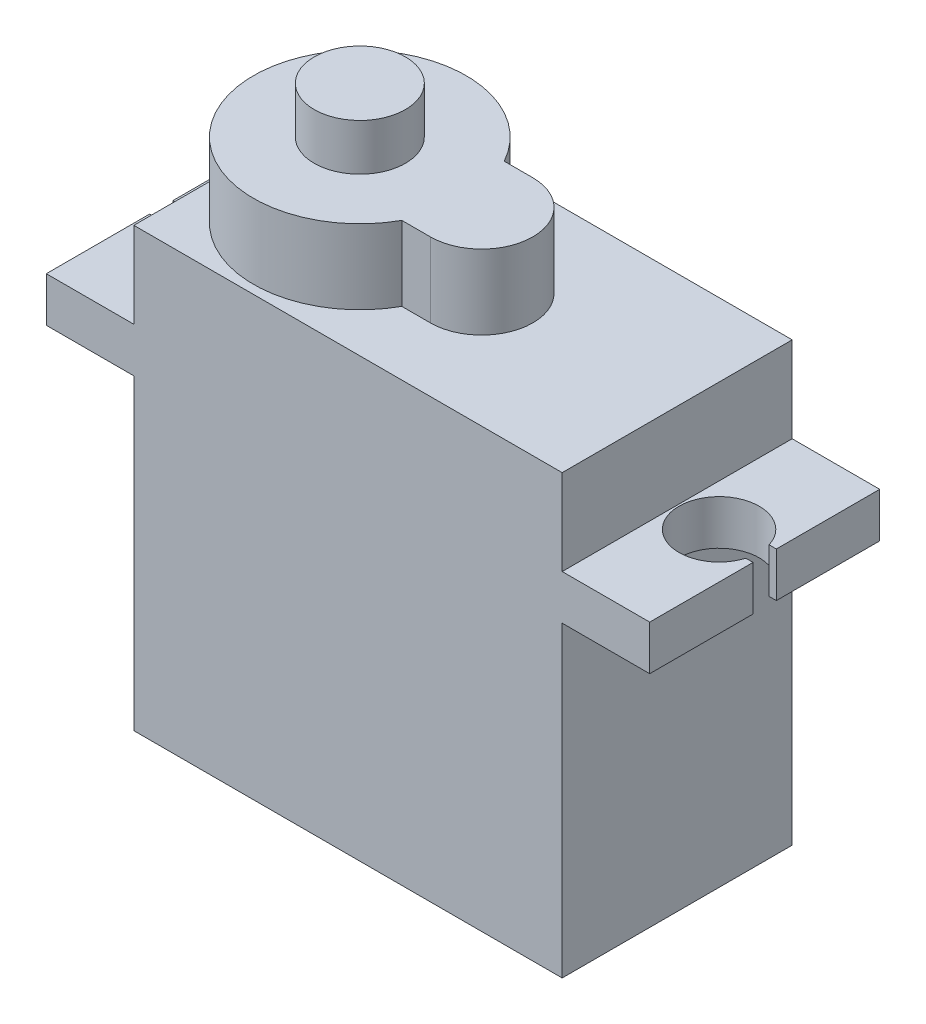
ISO-10303-21;
HEADER;
FILE_DESCRIPTION(('STEP AP214'),'2;1');
FILE_NAME('part.step','',(''),(''),'','','');
FILE_SCHEMA(('AUTOMOTIVE_DESIGN { 1 0 10303 214 1 1 1 1 }'));
ENDSEC;
DATA;
#1=APPLICATION_CONTEXT('core data for automotive mechanical design processes');
#2=APPLICATION_PROTOCOL_DEFINITION('international standard','automotive_design',2000,#1);
#3=PRODUCT_CONTEXT('',#1,'mechanical');
#4=PRODUCT('Part','Part','',(#3));
#5=PRODUCT_RELATED_PRODUCT_CATEGORY('part','',(#4));
#6=PRODUCT_DEFINITION_FORMATION('','',#4);
#7=PRODUCT_DEFINITION_CONTEXT('part definition',#1,'design');
#8=PRODUCT_DEFINITION('design','',#6,#7);
#9=PRODUCT_DEFINITION_SHAPE('','',#8);
#10=(LENGTH_UNIT() NAMED_UNIT(*) SI_UNIT(.MILLI.,.METRE.));
#11=(NAMED_UNIT(*) PLANE_ANGLE_UNIT() SI_UNIT($,.RADIAN.));
#12=(NAMED_UNIT(*) SI_UNIT($,.STERADIAN.) SOLID_ANGLE_UNIT());
#13=UNCERTAINTY_MEASURE_WITH_UNIT(LENGTH_MEASURE(1.E-05),#10,'distance_accuracy_value','');
#14=(GEOMETRIC_REPRESENTATION_CONTEXT(3) GLOBAL_UNCERTAINTY_ASSIGNED_CONTEXT((#13)) GLOBAL_UNIT_ASSIGNED_CONTEXT((#10,
#11,#12)) REPRESENTATION_CONTEXT('',''));
#15=CARTESIAN_POINT('',(0.,0.,0.));
#16=DIRECTION('',(0.,0.,1.));
#17=DIRECTION('',(1.,0.,0.));
#18=AXIS2_PLACEMENT_3D('',#15,#16,#17);
#19=CARTESIAN_POINT('',(-4.7,18.9,6.175));
#20=DIRECTION('',(1.,0.,0.));
#21=DIRECTION('',(0.,0.,-1.));
#22=AXIS2_PLACEMENT_3D('',#19,#20,#21);
#23=PLANE('',#22);
#24=DIRECTION('',(0.,0.,-1.));
#25=VECTOR('',#24,1.);
#26=CARTESIAN_POINT('',(-4.7,18.9,6.175));
#27=LINE('',#26,#25);
#28=CARTESIAN_POINT('',(-4.7,18.9,6.175));
#29=VERTEX_POINT('',#28);
#30=CARTESIAN_POINT('',(-4.7,18.9,0.625));
#31=VERTEX_POINT('',#30);
#32=EDGE_CURVE('E349',#29,#31,#27,.T.);
#33=ORIENTED_EDGE('',*,*,#32,.T.);
#34=DIRECTION('',(0.,1.,0.));
#35=VECTOR('',#34,1.);
#36=CARTESIAN_POINT('',(-4.7,-0.001000000000001,0.625));
#37=LINE('',#36,#35);
#38=CARTESIAN_POINT('',(-4.7,16.5,0.625));
#39=VERTEX_POINT('',#38);
#40=EDGE_CURVE('E224',#39,#31,#37,.T.);
#41=ORIENTED_EDGE('',*,*,#40,.F.);
#42=DIRECTION('',(0.,0.,-1.));
#43=VECTOR('',#42,1.);
#44=CARTESIAN_POINT('',(-4.7,16.5,6.175));
#45=LINE('',#44,#43);
#46=CARTESIAN_POINT('',(-4.7,16.5,6.175));
#47=VERTEX_POINT('',#46);
#48=EDGE_CURVE('E346',#47,#39,#45,.T.);
#49=ORIENTED_EDGE('',*,*,#48,.F.);
#50=DIRECTION('',(0.,-1.,0.));
#51=VECTOR('',#50,1.);
#52=CARTESIAN_POINT('',(-4.7,18.9,6.175));
#53=LINE('',#52,#51);
#54=EDGE_CURVE('E311',#29,#47,#53,.T.);
#55=ORIENTED_EDGE('',*,*,#54,.F.);
#56=EDGE_LOOP('',(#33,#41,#49,#55));
#57=FACE_BOUND('',#56,.T.);
#58=ADVANCED_FACE('F33',(#57),#23,.F.);
#59=CARTESIAN_POINT('',(27.7,16.5,6.175));
#60=DIRECTION('',(-1.,0.,0.));
#61=DIRECTION('',(0.,-1.,0.));
#62=AXIS2_PLACEMENT_3D('',#59,#60,#61);
#63=PLANE('',#62);
#64=DIRECTION('',(0.,0.,-1.));
#65=VECTOR('',#64,1.);
#66=CARTESIAN_POINT('',(27.7,18.9,6.175));
#67=LINE('',#66,#65);
#68=CARTESIAN_POINT('',(27.7,18.9,-0.625));
#69=VERTEX_POINT('',#68);
#70=CARTESIAN_POINT('',(27.7,18.9,-6.175));
#71=VERTEX_POINT('',#70);
#72=EDGE_CURVE('E364',#69,#71,#67,.T.);
#73=ORIENTED_EDGE('',*,*,#72,.F.);
#74=DIRECTION('',(0.,1.,0.));
#75=VECTOR('',#74,1.);
#76=CARTESIAN_POINT('',(27.7,-0.001000000000001,-0.625));
#77=LINE('',#76,#75);
#78=CARTESIAN_POINT('',(27.7,16.5,-0.625));
#79=VERTEX_POINT('',#78);
#80=EDGE_CURVE('E241',#79,#69,#77,.T.);
#81=ORIENTED_EDGE('',*,*,#80,.F.);
#82=DIRECTION('',(0.,0.,-1.));
#83=VECTOR('',#82,1.);
#84=CARTESIAN_POINT('',(27.7,16.5,6.175));
#85=LINE('',#84,#83);
#86=CARTESIAN_POINT('',(27.7,16.5,-6.175));
#87=VERTEX_POINT('',#86);
#88=EDGE_CURVE('E368',#79,#87,#85,.T.);
#89=ORIENTED_EDGE('',*,*,#88,.T.);
#90=DIRECTION('',(0.,1.,0.));
#91=VECTOR('',#90,1.);
#92=CARTESIAN_POINT('',(27.7,16.5,-6.175));
#93=LINE('',#92,#91);
#94=EDGE_CURVE('E325',#87,#71,#93,.T.);
#95=ORIENTED_EDGE('',*,*,#94,.T.);
#96=EDGE_LOOP('',(#73,#81,#89,#95));
#97=FACE_BOUND('',#96,.T.);
#98=ADVANCED_FACE('F438',(#97),#63,.F.);
#99=CARTESIAN_POINT('',(5.96,27.5,0.));
#100=DIRECTION('',(0.,1.,0.));
#101=DIRECTION('',(-1.,0.,0.));
#102=AXIS2_PLACEMENT_3D('',#99,#100,#101);
#103=PLANE('',#102);
#104=CARTESIAN_POINT('',(5.96,27.5,0.));
#105=DIRECTION('',(0.,1.,0.));
#106=DIRECTION('',(-1.,0.,0.));
#107=AXIS2_PLACEMENT_3D('',#104,#105,#106);
#108=CIRCLE('',#107,5.71);
#109=CARTESIAN_POINT('',(10.9641582708783,27.5,-2.75));
#110=VERTEX_POINT('',#109);
#111=CARTESIAN_POINT('',(10.9641582708783,27.5,2.75));
#112=VERTEX_POINT('',#111);
#113=EDGE_CURVE('E256',#110,#112,#108,.T.);
#114=ORIENTED_EDGE('',*,*,#113,.T.);
#115=DIRECTION('',(1.,0.,0.));
#116=VECTOR('',#115,1.);
#117=CARTESIAN_POINT('',(12.5,27.5,2.75));
#118=LINE('',#117,#116);
#119=CARTESIAN_POINT('',(12.5,27.5,2.75));
#120=VERTEX_POINT('',#119);
#121=EDGE_CURVE('E259',#112,#120,#118,.T.);
#122=ORIENTED_EDGE('',*,*,#121,.T.);
#123=CARTESIAN_POINT('',(12.5,27.5,0.));
#124=DIRECTION('',(0.,1.,0.));
#125=DIRECTION('',(-1.,0.,0.));
#126=AXIS2_PLACEMENT_3D('',#123,#124,#125);
#127=CIRCLE('',#126,2.75);
#128=CARTESIAN_POINT('',(12.5,27.5,-2.75));
#129=VERTEX_POINT('',#128);
#130=EDGE_CURVE('E262',#120,#129,#127,.T.);
#131=ORIENTED_EDGE('',*,*,#130,.T.);
#132=DIRECTION('',(-1.,0.,0.));
#133=VECTOR('',#132,1.);
#134=CARTESIAN_POINT('',(12.5,27.5,-2.75));
#135=LINE('',#134,#133);
#136=EDGE_CURVE('E264',#129,#110,#135,.T.);
#137=ORIENTED_EDGE('',*,*,#136,.T.);
#138=EDGE_LOOP('',(#114,#122,#131,#137));
#139=FACE_BOUND('',#138,.T.);
#140=CARTESIAN_POINT('',(5.96,27.5,0.));
#141=DIRECTION('',(0.,1.,0.));
#142=DIRECTION('',(-1.,0.,0.));
#143=AXIS2_PLACEMENT_3D('',#140,#141,#142);
#144=CIRCLE('',#143,2.45);
#145=CARTESIAN_POINT('',(3.51,27.5,0.));
#146=VERTEX_POINT('',#145);
#147=EDGE_CURVE('E249',#146,#146,#144,.T.);
#148=ORIENTED_EDGE('',*,*,#147,.F.);
#149=EDGE_LOOP('',(#148));
#150=FACE_BOUND('',#149,.T.);
#151=ADVANCED_FACE('F469',(#139,#150),#103,.T.);
#152=CARTESIAN_POINT('',(23.,23.5,6.175));
#153=DIRECTION('',(0.,-1.,0.));
#154=DIRECTION('',(1.,0.,0.));
#155=AXIS2_PLACEMENT_3D('',#152,#153,#154);
#156=PLANE('',#155);
#157=DIRECTION('',(-1.,0.,0.));
#158=VECTOR('',#157,1.);
#159=CARTESIAN_POINT('',(23.,23.5,-6.175));
#160=LINE('',#159,#158);
#161=CARTESIAN_POINT('',(23.,23.5,-6.175));
#162=VERTEX_POINT('',#161);
#163=CARTESIAN_POINT('',(0.,23.5,-6.175));
#164=VERTEX_POINT('',#163);
#165=EDGE_CURVE('E332',#162,#164,#160,.T.);
#166=ORIENTED_EDGE('',*,*,#165,.T.);
#167=DIRECTION('',(0.,0.,-1.));
#168=VECTOR('',#167,1.);
#169=CARTESIAN_POINT('',(0.,23.5,6.175));
#170=LINE('',#169,#168);
#171=CARTESIAN_POINT('',(0.,23.5,6.175));
#172=VERTEX_POINT('',#171);
#173=EDGE_CURVE('E355',#172,#164,#170,.T.);
#174=ORIENTED_EDGE('',*,*,#173,.F.);
#175=DIRECTION('',(-1.,0.,0.));
#176=VECTOR('',#175,1.);
#177=CARTESIAN_POINT('',(23.,23.5,6.175));
#178=LINE('',#177,#176);
#179=CARTESIAN_POINT('',(23.,23.5,6.175));
#180=VERTEX_POINT('',#179);
#181=EDGE_CURVE('E305',#180,#172,#178,.T.);
#182=ORIENTED_EDGE('',*,*,#181,.F.);
#183=DIRECTION('',(0.,0.,-1.));
#184=VECTOR('',#183,1.);
#185=CARTESIAN_POINT('',(23.,23.5,6.175));
#186=LINE('',#185,#184);
#187=EDGE_CURVE('E358',#180,#162,#186,.T.);
#188=ORIENTED_EDGE('',*,*,#187,.T.);
#189=EDGE_LOOP('',(#166,#174,#182,#188));
#190=FACE_BOUND('',#189,.T.);
#191=CARTESIAN_POINT('',(5.96,23.5,0.));
#192=DIRECTION('',(0.,1.,0.));
#193=DIRECTION('',(-1.,0.,0.));
#194=AXIS2_PLACEMENT_3D('',#191,#192,#193);
#195=CIRCLE('',#194,5.71);
#196=CARTESIAN_POINT('',(10.9641582708783,23.5,-2.75));
#197=VERTEX_POINT('',#196);
#198=CARTESIAN_POINT('',(10.9641582708783,23.5,2.75));
#199=VERTEX_POINT('',#198);
#200=EDGE_CURVE('E253',#197,#199,#195,.T.);
#201=ORIENTED_EDGE('',*,*,#200,.F.);
#202=DIRECTION('',(-1.,0.,0.));
#203=VECTOR('',#202,1.);
#204=CARTESIAN_POINT('',(12.5,23.5,-2.75));
#205=LINE('',#204,#203);
#206=CARTESIAN_POINT('',(12.5,23.5,-2.75));
#207=VERTEX_POINT('',#206);
#208=EDGE_CURVE('E260',#207,#197,#205,.T.);
#209=ORIENTED_EDGE('',*,*,#208,.F.);
#210=CARTESIAN_POINT('',(12.5,23.5,0.));
#211=DIRECTION('',(0.,1.,0.));
#212=DIRECTION('',(-1.,0.,0.));
#213=AXIS2_PLACEMENT_3D('',#210,#211,#212);
#214=CIRCLE('',#213,2.75);
#215=CARTESIAN_POINT('',(12.5,23.5,2.75));
#216=VERTEX_POINT('',#215);
#217=EDGE_CURVE('E272',#216,#207,#214,.T.);
#218=ORIENTED_EDGE('',*,*,#217,.F.);
#219=DIRECTION('',(1.,0.,0.));
#220=VECTOR('',#219,1.);
#221=CARTESIAN_POINT('',(12.5,23.5,2.75));
#222=LINE('',#221,#220);
#223=EDGE_CURVE('E269',#199,#216,#222,.T.);
#224=ORIENTED_EDGE('',*,*,#223,.F.);
#225=EDGE_LOOP('',(#201,#209,#218,#224));
#226=FACE_BOUND('',#225,.T.);
#227=ADVANCED_FACE('F424',(#190,#226),#156,.F.);
#228=CARTESIAN_POINT('',(0.,16.5,6.175));
#229=DIRECTION('',(1.,0.,0.));
#230=DIRECTION('',(0.,1.,0.));
#231=AXIS2_PLACEMENT_3D('',#228,#229,#230);
#232=PLANE('',#231);
#233=DIRECTION('',(0.,-1.,0.));
#234=VECTOR('',#233,1.);
#235=CARTESIAN_POINT('',(0.,16.5,-6.175));
#236=LINE('',#235,#234);
#237=CARTESIAN_POINT('',(0.,16.5,-6.175));
#238=VERTEX_POINT('',#237);
#239=CARTESIAN_POINT('',(0.,0.,-6.175));
#240=VERTEX_POINT('',#239);
#241=EDGE_CURVE('E288',#238,#240,#236,.T.);
#242=ORIENTED_EDGE('',*,*,#241,.T.);
#243=DIRECTION('',(0.,0.,-1.));
#244=VECTOR('',#243,1.);
#245=CARTESIAN_POINT('',(0.,0.,6.175));
#246=LINE('',#245,#244);
#247=CARTESIAN_POINT('',(0.,0.,6.175));
#248=VERTEX_POINT('',#247);
#249=EDGE_CURVE('E11',#248,#240,#246,.T.);
#250=ORIENTED_EDGE('',*,*,#249,.F.);
#251=DIRECTION('',(0.,-1.,0.));
#252=VECTOR('',#251,1.);
#253=CARTESIAN_POINT('',(0.,16.5,6.175));
#254=LINE('',#253,#252);
#255=CARTESIAN_POINT('',(0.,16.5,6.175));
#256=VERTEX_POINT('',#255);
#257=EDGE_CURVE('E289',#256,#248,#254,.T.);
#258=ORIENTED_EDGE('',*,*,#257,.F.);
#259=DIRECTION('',(0.,0.,-1.));
#260=VECTOR('',#259,1.);
#261=CARTESIAN_POINT('',(0.,16.5,6.175));
#262=LINE('',#261,#260);
#263=EDGE_CURVE('E315',#256,#238,#262,.T.);
#264=ORIENTED_EDGE('',*,*,#263,.T.);
#265=EDGE_LOOP('',(#242,#250,#258,#264));
#266=FACE_BOUND('',#265,.T.);
#267=ADVANCED_FACE('F35',(#266),#232,.F.);
#268=CARTESIAN_POINT('',(0.,0.,6.175));
#269=DIRECTION('',(0.,1.,0.));
#270=DIRECTION('',(0.,0.,1.));
#271=AXIS2_PLACEMENT_3D('',#268,#269,#270);
#272=PLANE('',#271);
#273=DIRECTION('',(1.,0.,0.));
#274=VECTOR('',#273,1.);
#275=CARTESIAN_POINT('',(0.,0.,-6.175));
#276=LINE('',#275,#274);
#277=CARTESIAN_POINT('',(23.,0.,-6.175));
#278=VERTEX_POINT('',#277);
#279=EDGE_CURVE('E318',#240,#278,#276,.T.);
#280=ORIENTED_EDGE('',*,*,#279,.T.);
#281=DIRECTION('',(0.,0.,-1.));
#282=VECTOR('',#281,1.);
#283=CARTESIAN_POINT('',(23.,0.,6.175));
#284=LINE('',#283,#282);
#285=CARTESIAN_POINT('',(23.,0.,6.175));
#286=VERTEX_POINT('',#285);
#287=EDGE_CURVE('E41',#286,#278,#284,.T.);
#288=ORIENTED_EDGE('',*,*,#287,.F.);
#289=DIRECTION('',(1.,0.,0.));
#290=VECTOR('',#289,1.);
#291=CARTESIAN_POINT('',(0.,0.,6.175));
#292=LINE('',#291,#290);
#293=EDGE_CURVE('E292',#248,#286,#292,.T.);
#294=ORIENTED_EDGE('',*,*,#293,.F.);
#295=ORIENTED_EDGE('',*,*,#249,.T.);
#296=EDGE_LOOP('',(#280,#288,#294,#295));
#297=FACE_BOUND('',#296,.T.);
#298=ADVANCED_FACE('F401',(#297),#272,.F.);
#299=CARTESIAN_POINT('',(23.,0.,6.175));
#300=DIRECTION('',(-1.,0.,0.));
#301=DIRECTION('',(0.,0.,1.));
#302=AXIS2_PLACEMENT_3D('',#299,#300,#301);
#303=PLANE('',#302);
#304=DIRECTION('',(0.,1.,0.));
#305=VECTOR('',#304,1.);
#306=CARTESIAN_POINT('',(23.,0.,-6.175));
#307=LINE('',#306,#305);
#308=CARTESIAN_POINT('',(23.,16.5,-6.175));
#309=VERTEX_POINT('',#308);
#310=EDGE_CURVE('E320',#278,#309,#307,.T.);
#311=ORIENTED_EDGE('',*,*,#310,.T.);
#312=DIRECTION('',(0.,0.,-1.));
#313=VECTOR('',#312,1.);
#314=CARTESIAN_POINT('',(23.,16.5,6.175));
#315=LINE('',#314,#313);
#316=CARTESIAN_POINT('',(23.,16.5,6.175));
#317=VERTEX_POINT('',#316);
#318=EDGE_CURVE('E372',#317,#309,#315,.T.);
#319=ORIENTED_EDGE('',*,*,#318,.F.);
#320=DIRECTION('',(0.,1.,0.));
#321=VECTOR('',#320,1.);
#322=CARTESIAN_POINT('',(23.,0.,6.175));
#323=LINE('',#322,#321);
#324=EDGE_CURVE('E295',#286,#317,#323,.T.);
#325=ORIENTED_EDGE('',*,*,#324,.F.);
#326=ORIENTED_EDGE('',*,*,#287,.T.);
#327=EDGE_LOOP('',(#311,#319,#325,#326));
#328=FACE_BOUND('',#327,.T.);
#329=ADVANCED_FACE('F379',(#328),#303,.F.);
#330=CARTESIAN_POINT('',(23.,16.5,6.175));
#331=DIRECTION('',(0.,1.,0.));
#332=DIRECTION('',(-1.,0.,0.));
#333=AXIS2_PLACEMENT_3D('',#330,#331,#332);
#334=PLANE('',#333);
#335=ORIENTED_EDGE('',*,*,#88,.F.);
#336=DIRECTION('',(1.,0.,0.));
#337=VECTOR('',#336,1.);
#338=CARTESIAN_POINT('',(27.311332336136,16.5,-0.625));
#339=LINE('',#338,#337);
#340=CARTESIAN_POINT('',(27.311332336136,16.5,-0.625));
#341=VERTEX_POINT('',#340);
#342=EDGE_CURVE('E229',#341,#79,#339,.T.);
#343=ORIENTED_EDGE('',*,*,#342,.F.);
#344=CARTESIAN_POINT('',(25.25,16.5,0.));
#345=DIRECTION('',(0.,1.,0.));
#346=DIRECTION('',(-1.,0.,0.));
#347=AXIS2_PLACEMENT_3D('',#344,#345,#346);
#348=CIRCLE('',#347,2.154);
#349=CARTESIAN_POINT('',(27.311332336136,16.5,0.625));
#350=VERTEX_POINT('',#349);
#351=EDGE_CURVE('E209',#350,#341,#348,.F.);
#352=ORIENTED_EDGE('',*,*,#351,.F.);
#353=DIRECTION('',(-1.,0.,0.));
#354=VECTOR('',#353,1.);
#355=CARTESIAN_POINT('',(27.7,16.5,0.625));
#356=LINE('',#355,#354);
#357=CARTESIAN_POINT('',(27.7,16.5,0.625));
#358=VERTEX_POINT('',#357);
#359=EDGE_CURVE('E240',#358,#350,#356,.T.);
#360=ORIENTED_EDGE('',*,*,#359,.F.);
#361=CARTESIAN_POINT('',(27.7,16.5,6.175));
#362=VERTEX_POINT('',#361);
#363=EDGE_CURVE('E369',#362,#358,#85,.T.);
#364=ORIENTED_EDGE('',*,*,#363,.F.);
#365=DIRECTION('',(1.,0.,0.));
#366=VECTOR('',#365,1.);
#367=CARTESIAN_POINT('',(23.,16.5,6.175));
#368=LINE('',#367,#366);
#369=EDGE_CURVE('E297',#317,#362,#368,.T.);
#370=ORIENTED_EDGE('',*,*,#369,.F.);
#371=ORIENTED_EDGE('',*,*,#318,.T.);
#372=DIRECTION('',(1.,0.,0.));
#373=VECTOR('',#372,1.);
#374=CARTESIAN_POINT('',(23.,16.5,-6.175));
#375=LINE('',#374,#373);
#376=EDGE_CURVE('E322',#309,#87,#375,.T.);
#377=ORIENTED_EDGE('',*,*,#376,.T.);
#378=EDGE_LOOP('',(#335,#343,#352,#360,#364,#370,#371,#377));
#379=FACE_BOUND('',#378,.T.);
#380=ADVANCED_FACE('F390',(#379),#334,.F.);
#381=ORIENTED_EDGE('',*,*,#363,.T.);
#382=DIRECTION('',(0.,1.,0.));
#383=VECTOR('',#382,1.);
#384=CARTESIAN_POINT('',(27.7,-0.001000000000001,0.625));
#385=LINE('',#384,#383);
#386=CARTESIAN_POINT('',(27.7,18.9,0.625));
#387=VERTEX_POINT('',#386);
#388=EDGE_CURVE('E243',#358,#387,#385,.T.);
#389=ORIENTED_EDGE('',*,*,#388,.T.);
#390=CARTESIAN_POINT('',(27.7,18.9,6.175));
#391=VERTEX_POINT('',#390);
#392=EDGE_CURVE('E365',#391,#387,#67,.T.);
#393=ORIENTED_EDGE('',*,*,#392,.F.);
#394=DIRECTION('',(0.,1.,0.));
#395=VECTOR('',#394,1.);
#396=CARTESIAN_POINT('',(27.7,16.5,6.175));
#397=LINE('',#396,#395);
#398=EDGE_CURVE('E299',#362,#391,#397,.T.);
#399=ORIENTED_EDGE('',*,*,#398,.F.);
#400=EDGE_LOOP('',(#381,#389,#393,#399));
#401=FACE_BOUND('',#400,.T.);
#402=ADVANCED_FACE('F447',(#401),#63,.F.);
#403=CARTESIAN_POINT('',(27.7,18.9,6.175));
#404=DIRECTION('',(0.,-1.,0.));
#405=DIRECTION('',(1.,0.,0.));
#406=AXIS2_PLACEMENT_3D('',#403,#404,#405);
#407=PLANE('',#406);
#408=CARTESIAN_POINT('',(25.25,18.9,0.));
#409=DIRECTION('',(0.,1.,0.));
#410=DIRECTION('',(0.,0.,-1.));
#411=AXIS2_PLACEMENT_3D('',#408,#409,#410);
#412=CIRCLE('',#411,2.154);
#413=CARTESIAN_POINT('',(27.311332336136,18.9,-0.625));
#414=VERTEX_POINT('',#413);
#415=CARTESIAN_POINT('',(27.311332336136,18.9,0.625));
#416=VERTEX_POINT('',#415);
#417=EDGE_CURVE('E56',#414,#416,#412,.T.);
#418=ORIENTED_EDGE('',*,*,#417,.F.);
#419=DIRECTION('',(-1.,0.,0.));
#420=VECTOR('',#419,1.);
#421=CARTESIAN_POINT('',(27.311332336136,18.9,-0.625));
#422=LINE('',#421,#420);
#423=EDGE_CURVE('E234',#69,#414,#422,.T.);
#424=ORIENTED_EDGE('',*,*,#423,.F.);
#425=ORIENTED_EDGE('',*,*,#72,.T.);
#426=DIRECTION('',(-1.,0.,0.));
#427=VECTOR('',#426,1.);
#428=CARTESIAN_POINT('',(27.7,18.9,-6.175));
#429=LINE('',#428,#427);
#430=CARTESIAN_POINT('',(23.,18.9,-6.175));
#431=VERTEX_POINT('',#430);
#432=EDGE_CURVE('E328',#71,#431,#429,.T.);
#433=ORIENTED_EDGE('',*,*,#432,.T.);
#434=DIRECTION('',(0.,0.,-1.));
#435=VECTOR('',#434,1.);
#436=CARTESIAN_POINT('',(23.,18.9,6.175));
#437=LINE('',#436,#435);
#438=CARTESIAN_POINT('',(23.,18.9,6.175));
#439=VERTEX_POINT('',#438);
#440=EDGE_CURVE('E361',#439,#431,#437,.T.);
#441=ORIENTED_EDGE('',*,*,#440,.F.);
#442=DIRECTION('',(-1.,0.,0.));
#443=VECTOR('',#442,1.);
#444=CARTESIAN_POINT('',(27.7,18.9,6.175));
#445=LINE('',#444,#443);
#446=EDGE_CURVE('E301',#391,#439,#445,.T.);
#447=ORIENTED_EDGE('',*,*,#446,.F.);
#448=ORIENTED_EDGE('',*,*,#392,.T.);
#449=DIRECTION('',(1.,0.,0.));
#450=VECTOR('',#449,1.);
#451=CARTESIAN_POINT('',(27.7,18.9,0.625));
#452=LINE('',#451,#450);
#453=EDGE_CURVE('E232',#416,#387,#452,.T.);
#454=ORIENTED_EDGE('',*,*,#453,.F.);
#455=EDGE_LOOP('',(#418,#424,#425,#433,#441,#447,#448,#454));
#456=FACE_BOUND('',#455,.T.);
#457=ADVANCED_FACE('F432',(#456),#407,.F.);
#458=CARTESIAN_POINT('',(23.,18.9,6.175));
#459=DIRECTION('',(-1.,0.,0.));
#460=DIRECTION('',(0.,0.,1.));
#461=AXIS2_PLACEMENT_3D('',#458,#459,#460);
#462=PLANE('',#461);
#463=DIRECTION('',(0.,1.,0.));
#464=VECTOR('',#463,1.);
#465=CARTESIAN_POINT('',(23.,18.9,-6.175));
#466=LINE('',#465,#464);
#467=EDGE_CURVE('E330',#431,#162,#466,.T.);
#468=ORIENTED_EDGE('',*,*,#467,.T.);
#469=ORIENTED_EDGE('',*,*,#187,.F.);
#470=DIRECTION('',(0.,1.,0.));
#471=VECTOR('',#470,1.);
#472=CARTESIAN_POINT('',(23.,18.9,6.175));
#473=LINE('',#472,#471);
#474=EDGE_CURVE('E303',#439,#180,#473,.T.);
#475=ORIENTED_EDGE('',*,*,#474,.F.);
#476=ORIENTED_EDGE('',*,*,#440,.T.);
#477=EDGE_LOOP('',(#468,#469,#475,#476));
#478=FACE_BOUND('',#477,.T.);
#479=ADVANCED_FACE('F429',(#478),#462,.F.);
#480=CARTESIAN_POINT('',(0.,23.5,6.175));
#481=DIRECTION('',(1.,0.,0.));
#482=DIRECTION('',(0.,1.,0.));
#483=AXIS2_PLACEMENT_3D('',#480,#481,#482);
#484=PLANE('',#483);
#485=DIRECTION('',(0.,-1.,0.));
#486=VECTOR('',#485,1.);
#487=CARTESIAN_POINT('',(0.,23.5,-6.175));
#488=LINE('',#487,#486);
#489=CARTESIAN_POINT('',(0.,18.9,-6.175));
#490=VERTEX_POINT('',#489);
#491=EDGE_CURVE('E334',#164,#490,#488,.T.);
#492=ORIENTED_EDGE('',*,*,#491,.T.);
#493=DIRECTION('',(0.,0.,-1.));
#494=VECTOR('',#493,1.);
#495=CARTESIAN_POINT('',(0.,18.9,6.175));
#496=LINE('',#495,#494);
#497=CARTESIAN_POINT('',(0.,18.9,6.175));
#498=VERTEX_POINT('',#497);
#499=EDGE_CURVE('E352',#498,#490,#496,.T.);
#500=ORIENTED_EDGE('',*,*,#499,.F.);
#501=DIRECTION('',(0.,-1.,0.));
#502=VECTOR('',#501,1.);
#503=CARTESIAN_POINT('',(0.,23.5,6.175));
#504=LINE('',#503,#502);
#505=EDGE_CURVE('E307',#172,#498,#504,.T.);
#506=ORIENTED_EDGE('',*,*,#505,.F.);
#507=ORIENTED_EDGE('',*,*,#173,.T.);
#508=EDGE_LOOP('',(#492,#500,#506,#507));
#509=FACE_BOUND('',#508,.T.);
#510=ADVANCED_FACE('F419',(#509),#484,.F.);
#511=CARTESIAN_POINT('',(0.,18.9,6.175));
#512=DIRECTION('',(0.,-1.,0.));
#513=DIRECTION('',(0.,0.,-1.));
#514=AXIS2_PLACEMENT_3D('',#511,#512,#513);
#515=PLANE('',#514);
#516=CARTESIAN_POINT('',(-2.25,18.9,0.));
#517=DIRECTION('',(0.,1.,0.));
#518=DIRECTION('',(0.,0.,-1.));
#519=AXIS2_PLACEMENT_3D('',#516,#517,#518);
#520=CIRCLE('',#519,2.154);
#521=CARTESIAN_POINT('',(-4.31133233613603,18.9,0.625));
#522=VERTEX_POINT('',#521);
#523=CARTESIAN_POINT('',(-4.31133233613603,18.9,-0.625));
#524=VERTEX_POINT('',#523);
#525=EDGE_CURVE('E201',#522,#524,#520,.T.);
#526=ORIENTED_EDGE('',*,*,#525,.F.);
#527=DIRECTION('',(1.,0.,0.));
#528=VECTOR('',#527,1.);
#529=CARTESIAN_POINT('',(-4.7,18.9,0.625));
#530=LINE('',#529,#528);
#531=EDGE_CURVE('E203',#31,#522,#530,.T.);
#532=ORIENTED_EDGE('',*,*,#531,.F.);
#533=ORIENTED_EDGE('',*,*,#32,.F.);
#534=DIRECTION('',(-1.,0.,0.));
#535=VECTOR('',#534,1.);
#536=CARTESIAN_POINT('',(0.,18.9,6.175));
#537=LINE('',#536,#535);
#538=EDGE_CURVE('E309',#498,#29,#537,.T.);
#539=ORIENTED_EDGE('',*,*,#538,.F.);
#540=ORIENTED_EDGE('',*,*,#499,.T.);
#541=DIRECTION('',(-1.,0.,0.));
#542=VECTOR('',#541,1.);
#543=CARTESIAN_POINT('',(0.,18.9,-6.175));
#544=LINE('',#543,#542);
#545=CARTESIAN_POINT('',(-4.7,18.9,-6.175));
#546=VERTEX_POINT('',#545);
#547=EDGE_CURVE('E336',#490,#546,#544,.T.);
#548=ORIENTED_EDGE('',*,*,#547,.T.);
#549=CARTESIAN_POINT('',(-4.7,18.9,-0.625));
#550=VERTEX_POINT('',#549);
#551=EDGE_CURVE('E348',#550,#546,#27,.T.);
#552=ORIENTED_EDGE('',*,*,#551,.F.);
#553=DIRECTION('',(-1.,0.,0.));
#554=VECTOR('',#553,1.);
#555=CARTESIAN_POINT('',(-4.7,18.9,-0.625));
#556=LINE('',#555,#554);
#557=EDGE_CURVE('E219',#524,#550,#556,.T.);
#558=ORIENTED_EDGE('',*,*,#557,.F.);
#559=EDGE_LOOP('',(#526,#532,#533,#539,#540,#548,#552,#558));
#560=FACE_BOUND('',#559,.T.);
#561=ADVANCED_FACE('F412',(#560),#515,.F.);
#562=CARTESIAN_POINT('',(-4.7,16.5,-0.625000000000001));
#563=VERTEX_POINT('',#562);
#564=CARTESIAN_POINT('',(-4.7,16.5,-6.175));
#565=VERTEX_POINT('',#564);
#566=EDGE_CURVE('E345',#563,#565,#45,.T.);
#567=ORIENTED_EDGE('',*,*,#566,.F.);
#568=DIRECTION('',(0.,1.,0.));
#569=VECTOR('',#568,1.);
#570=CARTESIAN_POINT('',(-4.7,-0.001000000000001,-0.625));
#571=LINE('',#570,#569);
#572=EDGE_CURVE('E48',#563,#550,#571,.T.);
#573=ORIENTED_EDGE('',*,*,#572,.T.);
#574=ORIENTED_EDGE('',*,*,#551,.T.);
#575=DIRECTION('',(0.,-1.,0.));
#576=VECTOR('',#575,1.);
#577=CARTESIAN_POINT('',(-4.7,18.9,-6.175));
#578=LINE('',#577,#576);
#579=EDGE_CURVE('E339',#546,#565,#578,.T.);
#580=ORIENTED_EDGE('',*,*,#579,.T.);
#581=EDGE_LOOP('',(#567,#573,#574,#580));
#582=FACE_BOUND('',#581,.T.);
#583=ADVANCED_FACE('F409',(#582),#23,.F.);
#584=CARTESIAN_POINT('',(-4.7,16.5,6.175));
#585=DIRECTION('',(0.,1.,0.));
#586=DIRECTION('',(0.,0.,1.));
#587=AXIS2_PLACEMENT_3D('',#584,#585,#586);
#588=PLANE('',#587);
#589=ORIENTED_EDGE('',*,*,#48,.T.);
#590=DIRECTION('',(-1.,0.,0.));
#591=VECTOR('',#590,1.);
#592=CARTESIAN_POINT('',(-4.7,16.5,0.625));
#593=LINE('',#592,#591);
#594=CARTESIAN_POINT('',(-4.31133233613603,16.5,0.625));
#595=VERTEX_POINT('',#594);
#596=EDGE_CURVE('E214',#595,#39,#593,.T.);
#597=ORIENTED_EDGE('',*,*,#596,.F.);
#598=CARTESIAN_POINT('',(-2.25,16.5,0.));
#599=DIRECTION('',(0.,1.,0.));
#600=DIRECTION('',(0.,0.,1.));
#601=AXIS2_PLACEMENT_3D('',#598,#599,#600);
#602=CIRCLE('',#601,2.154);
#603=CARTESIAN_POINT('',(-4.31133233613603,16.5,-0.625));
#604=VERTEX_POINT('',#603);
#605=EDGE_CURVE('E198',#604,#595,#602,.F.);
#606=ORIENTED_EDGE('',*,*,#605,.F.);
#607=DIRECTION('',(1.,0.,0.));
#608=VECTOR('',#607,1.);
#609=CARTESIAN_POINT('',(-4.7,16.5,-0.625));
#610=LINE('',#609,#608);
#611=EDGE_CURVE('E205',#563,#604,#610,.T.);
#612=ORIENTED_EDGE('',*,*,#611,.F.);
#613=ORIENTED_EDGE('',*,*,#566,.T.);
#614=DIRECTION('',(1.,0.,0.));
#615=VECTOR('',#614,1.);
#616=CARTESIAN_POINT('',(-4.7,16.5,-6.175));
#617=LINE('',#616,#615);
#618=EDGE_CURVE('E293',#565,#238,#617,.T.);
#619=ORIENTED_EDGE('',*,*,#618,.T.);
#620=ORIENTED_EDGE('',*,*,#263,.F.);
#621=DIRECTION('',(1.,0.,0.));
#622=VECTOR('',#621,1.);
#623=CARTESIAN_POINT('',(-4.7,16.5,6.175));
#624=LINE('',#623,#622);
#625=EDGE_CURVE('E313',#47,#256,#624,.T.);
#626=ORIENTED_EDGE('',*,*,#625,.F.);
#627=EDGE_LOOP('',(#589,#597,#606,#612,#613,#619,#620,#626));
#628=FACE_BOUND('',#627,.T.);
#629=ADVANCED_FACE('F213',(#628),#588,.F.);
#630=CARTESIAN_POINT('',(0.,0.,6.175));
#631=DIRECTION('',(0.,0.,1.));
#632=DIRECTION('',(1.,0.,0.));
#633=AXIS2_PLACEMENT_3D('',#630,#631,#632);
#634=PLANE('',#633);
#635=ORIENTED_EDGE('',*,*,#257,.T.);
#636=ORIENTED_EDGE('',*,*,#293,.T.);
#637=ORIENTED_EDGE('',*,*,#324,.T.);
#638=ORIENTED_EDGE('',*,*,#369,.T.);
#639=ORIENTED_EDGE('',*,*,#398,.T.);
#640=ORIENTED_EDGE('',*,*,#446,.T.);
#641=ORIENTED_EDGE('',*,*,#474,.T.);
#642=ORIENTED_EDGE('',*,*,#181,.T.);
#643=ORIENTED_EDGE('',*,*,#505,.T.);
#644=ORIENTED_EDGE('',*,*,#538,.T.);
#645=ORIENTED_EDGE('',*,*,#54,.T.);
#646=ORIENTED_EDGE('',*,*,#625,.T.);
#647=EDGE_LOOP('',(#635,#636,#637,#638,#639,#640,#641,#642,#643,#644,#645,#646));
#648=FACE_BOUND('',#647,.T.);
#649=ADVANCED_FACE('F397',(#648),#634,.T.);
#650=CARTESIAN_POINT('',(0.,0.,-6.175));
#651=DIRECTION('',(0.,0.,1.));
#652=DIRECTION('',(1.,0.,0.));
#653=AXIS2_PLACEMENT_3D('',#650,#651,#652);
#654=PLANE('',#653);
#655=ORIENTED_EDGE('',*,*,#241,.F.);
#656=ORIENTED_EDGE('',*,*,#618,.F.);
#657=ORIENTED_EDGE('',*,*,#579,.F.);
#658=ORIENTED_EDGE('',*,*,#547,.F.);
#659=ORIENTED_EDGE('',*,*,#491,.F.);
#660=ORIENTED_EDGE('',*,*,#165,.F.);
#661=ORIENTED_EDGE('',*,*,#467,.F.);
#662=ORIENTED_EDGE('',*,*,#432,.F.);
#663=ORIENTED_EDGE('',*,*,#94,.F.);
#664=ORIENTED_EDGE('',*,*,#376,.F.);
#665=ORIENTED_EDGE('',*,*,#310,.F.);
#666=ORIENTED_EDGE('',*,*,#279,.F.);
#667=EDGE_LOOP('',(#655,#656,#657,#658,#659,#660,#661,#662,#663,#664,#665,#666));
#668=FACE_BOUND('',#667,.T.);
#669=ADVANCED_FACE('F385',(#668),#654,.F.);
#670=CARTESIAN_POINT('',(5.96,27.5,0.));
#671=DIRECTION('',(0.,-1.,0.));
#672=DIRECTION('',(1.,0.,0.));
#673=AXIS2_PLACEMENT_3D('',#670,#671,#672);
#674=CYLINDRICAL_SURFACE('',#673,5.71);
#675=ORIENTED_EDGE('',*,*,#200,.T.);
#676=DIRECTION('',(0.,-1.,0.));
#677=VECTOR('',#676,1.);
#678=CARTESIAN_POINT('',(10.9641582708783,27.5,2.75));
#679=LINE('',#678,#677);
#680=EDGE_CURVE('E285',#112,#199,#679,.T.);
#681=ORIENTED_EDGE('',*,*,#680,.F.);
#682=ORIENTED_EDGE('',*,*,#113,.F.);
#683=DIRECTION('',(0.,-1.,0.));
#684=VECTOR('',#683,1.);
#685=CARTESIAN_POINT('',(10.9641582708783,27.5,-2.75));
#686=LINE('',#685,#684);
#687=EDGE_CURVE('E266',#110,#197,#686,.T.);
#688=ORIENTED_EDGE('',*,*,#687,.T.);
#689=EDGE_LOOP('',(#675,#681,#682,#688));
#690=FACE_BOUND('',#689,.T.);
#691=ADVANCED_FACE('F623',(#690),#674,.T.);
#692=CARTESIAN_POINT('',(12.5,27.5,2.75));
#693=DIRECTION('',(0.,0.,-1.));
#694=DIRECTION('',(-1.,0.,0.));
#695=AXIS2_PLACEMENT_3D('',#692,#693,#694);
#696=PLANE('',#695);
#697=ORIENTED_EDGE('',*,*,#223,.T.);
#698=DIRECTION('',(0.,-1.,0.));
#699=VECTOR('',#698,1.);
#700=CARTESIAN_POINT('',(12.5,27.5,2.75));
#701=LINE('',#700,#699);
#702=EDGE_CURVE('E282',#120,#216,#701,.T.);
#703=ORIENTED_EDGE('',*,*,#702,.F.);
#704=ORIENTED_EDGE('',*,*,#121,.F.);
#705=ORIENTED_EDGE('',*,*,#680,.T.);
#706=EDGE_LOOP('',(#697,#703,#704,#705));
#707=FACE_BOUND('',#706,.T.);
#708=ADVANCED_FACE('F619',(#707),#696,.F.);
#709=CARTESIAN_POINT('',(12.5,27.5,0.));
#710=DIRECTION('',(0.,-1.,0.));
#711=DIRECTION('',(1.,0.,0.));
#712=AXIS2_PLACEMENT_3D('',#709,#710,#711);
#713=CYLINDRICAL_SURFACE('',#712,2.75);
#714=ORIENTED_EDGE('',*,*,#217,.T.);
#715=DIRECTION('',(0.,-1.,0.));
#716=VECTOR('',#715,1.);
#717=CARTESIAN_POINT('',(12.5,27.5,-2.75));
#718=LINE('',#717,#716);
#719=EDGE_CURVE('E279',#129,#207,#718,.T.);
#720=ORIENTED_EDGE('',*,*,#719,.F.);
#721=ORIENTED_EDGE('',*,*,#130,.F.);
#722=ORIENTED_EDGE('',*,*,#702,.T.);
#723=EDGE_LOOP('',(#714,#720,#721,#722));
#724=FACE_BOUND('',#723,.T.);
#725=ADVANCED_FACE('F615',(#724),#713,.T.);
#726=CARTESIAN_POINT('',(12.5,27.5,-2.75));
#727=DIRECTION('',(0.,0.,1.));
#728=DIRECTION('',(1.,0.,0.));
#729=AXIS2_PLACEMENT_3D('',#726,#727,#728);
#730=PLANE('',#729);
#731=ORIENTED_EDGE('',*,*,#208,.T.);
#732=ORIENTED_EDGE('',*,*,#687,.F.);
#733=ORIENTED_EDGE('',*,*,#136,.F.);
#734=ORIENTED_EDGE('',*,*,#719,.T.);
#735=EDGE_LOOP('',(#731,#732,#733,#734));
#736=FACE_BOUND('',#735,.T.);
#737=ADVANCED_FACE('F610',(#736),#730,.F.);
#738=CARTESIAN_POINT('',(5.96,30.,0.));
#739=DIRECTION('',(0.,-1.,0.));
#740=DIRECTION('',(1.,0.,0.));
#741=AXIS2_PLACEMENT_3D('',#738,#739,#740);
#742=CYLINDRICAL_SURFACE('',#741,2.45);
#743=CARTESIAN_POINT('',(5.96,30.,0.));
#744=DIRECTION('',(0.,1.,0.));
#745=DIRECTION('',(-1.,0.,0.));
#746=AXIS2_PLACEMENT_3D('',#743,#744,#745);
#747=CIRCLE('',#746,2.45);
#748=CARTESIAN_POINT('',(3.51,30.,0.));
#749=VERTEX_POINT('',#748);
#750=EDGE_CURVE('E250',#749,#749,#747,.T.);
#751=ORIENTED_EDGE('',*,*,#750,.F.);
#752=EDGE_LOOP('',(#751));
#753=FACE_BOUND('',#752,.T.);
#754=ORIENTED_EDGE('',*,*,#147,.T.);
#755=EDGE_LOOP('',(#754));
#756=FACE_BOUND('',#755,.T.);
#757=ADVANCED_FACE('F607',(#753,#756),#742,.T.);
#758=CARTESIAN_POINT('',(5.96,30.,0.));
#759=DIRECTION('',(0.,1.,0.));
#760=DIRECTION('',(-1.,0.,0.));
#761=AXIS2_PLACEMENT_3D('',#758,#759,#760);
#762=PLANE('',#761);
#763=ORIENTED_EDGE('',*,*,#750,.T.);
#764=EDGE_LOOP('',(#763));
#765=FACE_BOUND('',#764,.T.);
#766=ADVANCED_FACE('F568',(#765),#762,.T.);
#767=CARTESIAN_POINT('',(25.25,-0.001000000000001,0.));
#768=DIRECTION('',(0.,1.,0.));
#769=DIRECTION('',(0.,0.,1.));
#770=AXIS2_PLACEMENT_3D('',#767,#768,#769);
#771=CYLINDRICAL_SURFACE('',#770,2.154);
#772=ORIENTED_EDGE('',*,*,#351,.T.);
#773=DIRECTION('',(0.,1.,0.));
#774=VECTOR('',#773,1.);
#775=CARTESIAN_POINT('',(27.311332336136,-0.001000000000001,-0.625));
#776=LINE('',#775,#774);
#777=EDGE_CURVE('E238',#341,#414,#776,.T.);
#778=ORIENTED_EDGE('',*,*,#777,.T.);
#779=ORIENTED_EDGE('',*,*,#417,.T.);
#780=DIRECTION('',(0.,1.,0.));
#781=VECTOR('',#780,1.);
#782=CARTESIAN_POINT('',(27.311332336136,-0.001000000000001,0.625));
#783=LINE('',#782,#781);
#784=EDGE_CURVE('E237',#350,#416,#783,.T.);
#785=ORIENTED_EDGE('',*,*,#784,.F.);
#786=EDGE_LOOP('',(#772,#778,#779,#785));
#787=FACE_BOUND('',#786,.T.);
#788=ADVANCED_FACE('F442',(#787),#771,.F.);
#789=CARTESIAN_POINT('',(27.311332336136,-0.001000000000001,-0.625));
#790=DIRECTION('',(0.,0.,-1.));
#791=DIRECTION('',(-1.,0.,0.));
#792=AXIS2_PLACEMENT_3D('',#789,#790,#791);
#793=PLANE('',#792);
#794=ORIENTED_EDGE('',*,*,#342,.T.);
#795=ORIENTED_EDGE('',*,*,#80,.T.);
#796=ORIENTED_EDGE('',*,*,#423,.T.);
#797=ORIENTED_EDGE('',*,*,#777,.F.);
#798=EDGE_LOOP('',(#794,#795,#796,#797));
#799=FACE_BOUND('',#798,.T.);
#800=ADVANCED_FACE('F440',(#799),#793,.F.);
#801=CARTESIAN_POINT('',(27.7,-0.001000000000001,0.625));
#802=DIRECTION('',(0.,0.,1.));
#803=DIRECTION('',(1.,0.,0.));
#804=AXIS2_PLACEMENT_3D('',#801,#802,#803);
#805=PLANE('',#804);
#806=ORIENTED_EDGE('',*,*,#359,.T.);
#807=ORIENTED_EDGE('',*,*,#784,.T.);
#808=ORIENTED_EDGE('',*,*,#453,.T.);
#809=ORIENTED_EDGE('',*,*,#388,.F.);
#810=EDGE_LOOP('',(#806,#807,#808,#809));
#811=FACE_BOUND('',#810,.T.);
#812=ADVANCED_FACE('F445',(#811),#805,.F.);
#813=CARTESIAN_POINT('',(-2.25,-0.001000000000001,0.));
#814=DIRECTION('',(0.,1.,0.));
#815=DIRECTION('',(0.,0.,1.));
#816=AXIS2_PLACEMENT_3D('',#813,#814,#815);
#817=CYLINDRICAL_SURFACE('',#816,2.154);
#818=ORIENTED_EDGE('',*,*,#605,.T.);
#819=DIRECTION('',(0.,1.,0.));
#820=VECTOR('',#819,1.);
#821=CARTESIAN_POINT('',(-4.31133233613603,-0.001000000000001,0.625));
#822=LINE('',#821,#820);
#823=EDGE_CURVE('E210',#595,#522,#822,.T.);
#824=ORIENTED_EDGE('',*,*,#823,.T.);
#825=ORIENTED_EDGE('',*,*,#525,.T.);
#826=DIRECTION('',(0.,1.,0.));
#827=VECTOR('',#826,1.);
#828=CARTESIAN_POINT('',(-4.31133233613603,-0.001000000000001,-0.625));
#829=LINE('',#828,#827);
#830=EDGE_CURVE('E195',#604,#524,#829,.T.);
#831=ORIENTED_EDGE('',*,*,#830,.F.);
#832=EDGE_LOOP('',(#818,#824,#825,#831));
#833=FACE_BOUND('',#832,.T.);
#834=ADVANCED_FACE('F196',(#833),#817,.F.);
#835=CARTESIAN_POINT('',(-4.7,-0.001000000000001,0.625));
#836=DIRECTION('',(0.,0.,1.));
#837=DIRECTION('',(1.,0.,0.));
#838=AXIS2_PLACEMENT_3D('',#835,#836,#837);
#839=PLANE('',#838);
#840=ORIENTED_EDGE('',*,*,#596,.T.);
#841=ORIENTED_EDGE('',*,*,#40,.T.);
#842=ORIENTED_EDGE('',*,*,#531,.T.);
#843=ORIENTED_EDGE('',*,*,#823,.F.);
#844=EDGE_LOOP('',(#840,#841,#842,#843));
#845=FACE_BOUND('',#844,.T.);
#846=ADVANCED_FACE('F455',(#845),#839,.F.);
#847=CARTESIAN_POINT('',(-4.7,-0.001000000000001,-0.625));
#848=DIRECTION('',(0.,0.,-1.));
#849=DIRECTION('',(-1.,0.,0.));
#850=AXIS2_PLACEMENT_3D('',#847,#848,#849);
#851=PLANE('',#850);
#852=ORIENTED_EDGE('',*,*,#611,.T.);
#853=ORIENTED_EDGE('',*,*,#830,.T.);
#854=ORIENTED_EDGE('',*,*,#557,.T.);
#855=ORIENTED_EDGE('',*,*,#572,.F.);
#856=EDGE_LOOP('',(#852,#853,#854,#855));
#857=FACE_BOUND('',#856,.T.);
#858=ADVANCED_FACE('F206',(#857),#851,.F.);
#859=CLOSED_SHELL('',(#58,#98,#151,#227,#267,#298,#329,#380,#402,#457,#479,#510,#561,#583,#629,
#649,#669,#691,#708,#725,#737,#757,#766,#788,#800,#812,#834,#846,#858));
#860=MANIFOLD_SOLID_BREP('B2',#859);
#861=ADVANCED_BREP_SHAPE_REPRESENTATION('',(#18,#860),#14);
#862=SHAPE_DEFINITION_REPRESENTATION(#9,#861);
ENDSEC;
END-ISO-10303-21;
